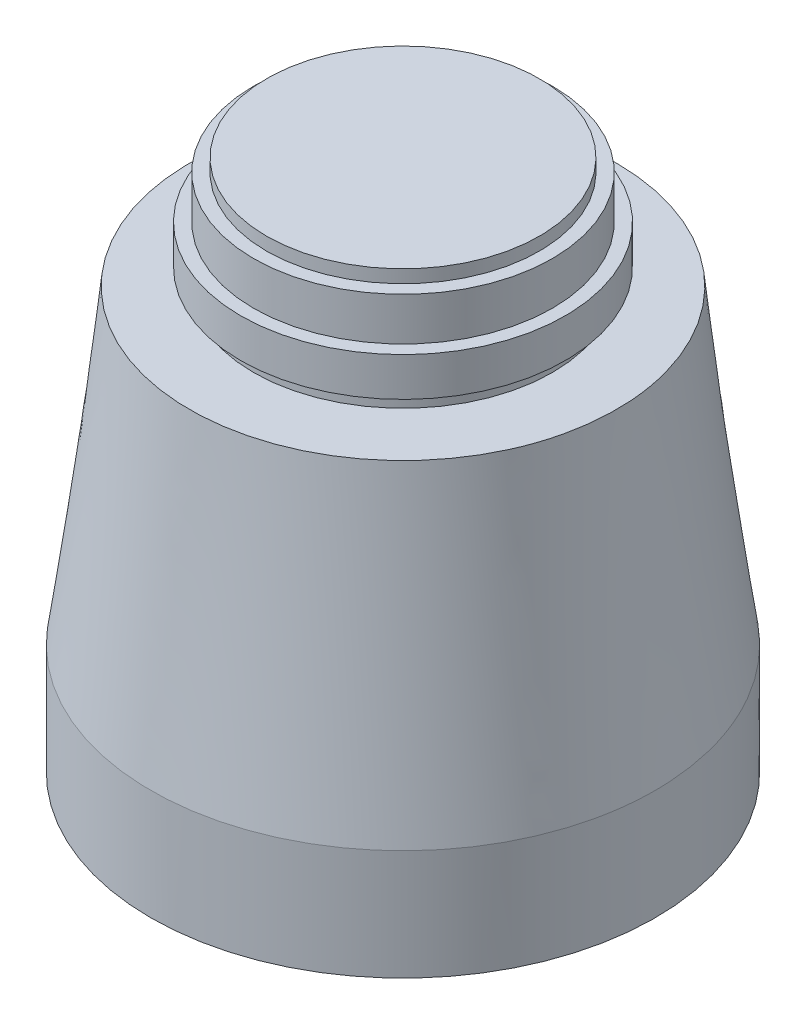
ISO-10303-21;
HEADER;
FILE_DESCRIPTION(('STEP AP214'),'2;1');
FILE_NAME('part.step','',(''),(''),'','','');
FILE_SCHEMA(('AUTOMOTIVE_DESIGN { 1 0 10303 214 1 1 1 1 }'));
ENDSEC;
DATA;
#1=APPLICATION_CONTEXT('core data for automotive mechanical design processes');
#2=APPLICATION_PROTOCOL_DEFINITION('international standard','automotive_design',2000,#1);
#3=PRODUCT_CONTEXT('',#1,'mechanical');
#4=PRODUCT('Part','Part','',(#3));
#5=PRODUCT_RELATED_PRODUCT_CATEGORY('part','',(#4));
#6=PRODUCT_DEFINITION_FORMATION('','',#4);
#7=PRODUCT_DEFINITION_CONTEXT('part definition',#1,'design');
#8=PRODUCT_DEFINITION('design','',#6,#7);
#9=PRODUCT_DEFINITION_SHAPE('','',#8);
#10=(LENGTH_UNIT() NAMED_UNIT(*) SI_UNIT(.MILLI.,.METRE.));
#11=(NAMED_UNIT(*) PLANE_ANGLE_UNIT() SI_UNIT($,.RADIAN.));
#12=(NAMED_UNIT(*) SI_UNIT($,.STERADIAN.) SOLID_ANGLE_UNIT());
#13=UNCERTAINTY_MEASURE_WITH_UNIT(LENGTH_MEASURE(1.E-05),#10,'distance_accuracy_value','');
#14=(GEOMETRIC_REPRESENTATION_CONTEXT(3) GLOBAL_UNCERTAINTY_ASSIGNED_CONTEXT((#13)) GLOBAL_UNIT_ASSIGNED_CONTEXT((#10,
#11,#12)) REPRESENTATION_CONTEXT('',''));
#15=CARTESIAN_POINT('',(0.,0.,0.));
#16=DIRECTION('',(0.,0.,1.));
#17=DIRECTION('',(1.,0.,0.));
#18=AXIS2_PLACEMENT_3D('',#15,#16,#17);
#19=CARTESIAN_POINT('',(0.,32.53,0.));
#20=DIRECTION('',(0.,1.,0.));
#21=DIRECTION('',(0.,0.,1.));
#22=AXIS2_PLACEMENT_3D('',#19,#20,#21);
#23=PLANE('',#22);
#24=CARTESIAN_POINT('',(0.,32.53,0.));
#25=DIRECTION('',(0.,1.,0.));
#26=DIRECTION('',(0.,0.,1.));
#27=AXIS2_PLACEMENT_3D('',#24,#25,#26);
#28=CIRCLE('',#27,11.55);
#29=CARTESIAN_POINT('',(0.,32.53,11.55));
#30=VERTEX_POINT('',#29);
#31=EDGE_CURVE('E46',#30,#30,#28,.T.);
#32=ORIENTED_EDGE('',*,*,#31,.F.);
#33=EDGE_LOOP('',(#32));
#34=FACE_BOUND('',#33,.T.);
#35=CARTESIAN_POINT('',(0.,32.53,0.));
#36=DIRECTION('',(0.,1.,0.));
#37=DIRECTION('',(0.,0.,1.));
#38=AXIS2_PLACEMENT_3D('',#35,#36,#37);
#39=CIRCLE('',#38,16.5);
#40=CARTESIAN_POINT('',(-16.4507498294767,32.53,-1.27390346885986));
#41=VERTEX_POINT('',#40);
#42=EDGE_CURVE('E81',#41,#41,#39,.T.);
#43=ORIENTED_EDGE('',*,*,#42,.T.);
#44=EDGE_LOOP('',(#43));
#45=FACE_BOUND('',#44,.T.);
#46=ADVANCED_FACE('F39',(#34,#45),#23,.T.);
#47=CARTESIAN_POINT('',(0.,41.16,0.));
#48=DIRECTION('',(0.,-1.,0.));
#49=DIRECTION('',(0.,0.,-1.));
#50=AXIS2_PLACEMENT_3D('',#47,#48,#49);
#51=CYLINDRICAL_SURFACE('',#50,11.55);
#52=CARTESIAN_POINT('',(0.,36.83,0.));
#53=DIRECTION('',(0.,1.,0.));
#54=DIRECTION('',(0.,0.,1.));
#55=AXIS2_PLACEMENT_3D('',#52,#53,#54);
#56=CIRCLE('',#55,11.55);
#57=CARTESIAN_POINT('',(0.,36.83,11.55));
#58=VERTEX_POINT('',#57);
#59=EDGE_CURVE('E55',#58,#58,#56,.T.);
#60=ORIENTED_EDGE('',*,*,#59,.T.);
#61=EDGE_LOOP('',(#60));
#62=FACE_BOUND('',#61,.T.);
#63=CARTESIAN_POINT('',(0.,40.16,0.));
#64=DIRECTION('',(0.,1.,0.));
#65=DIRECTION('',(0.,0.,1.));
#66=AXIS2_PLACEMENT_3D('',#63,#64,#65);
#67=CIRCLE('',#66,11.55);
#68=CARTESIAN_POINT('',(0.,40.16,11.55));
#69=VERTEX_POINT('',#68);
#70=EDGE_CURVE('E68',#69,#69,#67,.T.);
#71=ORIENTED_EDGE('',*,*,#70,.F.);
#72=EDGE_LOOP('',(#71));
#73=FACE_BOUND('',#72,.T.);
#74=ADVANCED_FACE('F105',(#62,#73),#51,.T.);
#75=ORIENTED_EDGE('',*,*,#31,.T.);
#76=EDGE_LOOP('',(#75));
#77=FACE_BOUND('',#76,.T.);
#78=CARTESIAN_POINT('',(0.,33.83,0.));
#79=DIRECTION('',(0.,1.,0.));
#80=DIRECTION('',(0.,0.,1.));
#81=AXIS2_PLACEMENT_3D('',#78,#79,#80);
#82=CIRCLE('',#81,11.55);
#83=CARTESIAN_POINT('',(0.,33.83,11.55));
#84=VERTEX_POINT('',#83);
#85=EDGE_CURVE('E11',#84,#84,#82,.T.);
#86=ORIENTED_EDGE('',*,*,#85,.F.);
#87=EDGE_LOOP('',(#86));
#88=FACE_BOUND('',#87,.T.);
#89=ADVANCED_FACE('F111',(#77,#88),#51,.T.);
#90=CARTESIAN_POINT('',(0.,33.83,0.));
#91=DIRECTION('',(0.,1.,0.));
#92=DIRECTION('',(0.,0.,1.));
#93=AXIS2_PLACEMENT_3D('',#90,#91,#92);
#94=CYLINDRICAL_SURFACE('',#93,12.55);
#95=CARTESIAN_POINT('',(0.,33.83,0.));
#96=DIRECTION('',(0.,1.,0.));
#97=DIRECTION('',(0.,0.,1.));
#98=AXIS2_PLACEMENT_3D('',#95,#96,#97);
#99=CIRCLE('',#98,12.55);
#100=CARTESIAN_POINT('',(0.,33.83,12.55));
#101=VERTEX_POINT('',#100);
#102=EDGE_CURVE('E61',#101,#101,#99,.T.);
#103=ORIENTED_EDGE('',*,*,#102,.T.);
#104=EDGE_LOOP('',(#103));
#105=FACE_BOUND('',#104,.T.);
#106=CARTESIAN_POINT('',(0.,36.83,0.));
#107=DIRECTION('',(0.,1.,0.));
#108=DIRECTION('',(0.,0.,1.));
#109=AXIS2_PLACEMENT_3D('',#106,#107,#108);
#110=CIRCLE('',#109,12.55);
#111=CARTESIAN_POINT('',(0.,36.83,12.55));
#112=VERTEX_POINT('',#111);
#113=EDGE_CURVE('E58',#112,#112,#110,.T.);
#114=ORIENTED_EDGE('',*,*,#113,.F.);
#115=EDGE_LOOP('',(#114));
#116=FACE_BOUND('',#115,.T.);
#117=ADVANCED_FACE('F114',(#105,#116),#94,.T.);
#118=CARTESIAN_POINT('',(0.,33.83,0.));
#119=DIRECTION('',(0.,1.,0.));
#120=DIRECTION('',(0.,0.,1.));
#121=AXIS2_PLACEMENT_3D('',#118,#119,#120);
#122=PLANE('',#121);
#123=ORIENTED_EDGE('',*,*,#85,.T.);
#124=EDGE_LOOP('',(#123));
#125=FACE_BOUND('',#124,.T.);
#126=ORIENTED_EDGE('',*,*,#102,.F.);
#127=EDGE_LOOP('',(#126));
#128=FACE_BOUND('',#127,.T.);
#129=ADVANCED_FACE('F117',(#125,#128),#122,.F.);
#130=CARTESIAN_POINT('',(0.,36.83,0.));
#131=DIRECTION('',(0.,1.,0.));
#132=DIRECTION('',(0.,0.,1.));
#133=AXIS2_PLACEMENT_3D('',#130,#131,#132);
#134=PLANE('',#133);
#135=ORIENTED_EDGE('',*,*,#59,.F.);
#136=EDGE_LOOP('',(#135));
#137=FACE_BOUND('',#136,.T.);
#138=ORIENTED_EDGE('',*,*,#113,.T.);
#139=EDGE_LOOP('',(#138));
#140=FACE_BOUND('',#139,.T.);
#141=ADVANCED_FACE('F118',(#137,#140),#134,.T.);
#142=CARTESIAN_POINT('',(0.,40.16,0.));
#143=DIRECTION('',(0.,1.,0.));
#144=DIRECTION('',(0.,0.,1.));
#145=AXIS2_PLACEMENT_3D('',#142,#143,#144);
#146=PLANE('',#145);
#147=CARTESIAN_POINT('',(0.,40.16,0.));
#148=DIRECTION('',(0.,1.,0.));
#149=DIRECTION('',(0.,0.,1.));
#150=AXIS2_PLACEMENT_3D('',#147,#148,#149);
#151=CIRCLE('',#150,10.55);
#152=CARTESIAN_POINT('',(0.,40.16,10.55));
#153=VERTEX_POINT('',#152);
#154=EDGE_CURVE('E72',#153,#153,#151,.T.);
#155=ORIENTED_EDGE('',*,*,#154,.F.);
#156=EDGE_LOOP('',(#155));
#157=FACE_BOUND('',#156,.T.);
#158=ORIENTED_EDGE('',*,*,#70,.T.);
#159=EDGE_LOOP('',(#158));
#160=FACE_BOUND('',#159,.T.);
#161=ADVANCED_FACE('F121',(#157,#160),#146,.T.);
#162=CARTESIAN_POINT('',(0.,40.16,0.));
#163=DIRECTION('',(0.,1.,0.));
#164=DIRECTION('',(0.,0.,1.));
#165=AXIS2_PLACEMENT_3D('',#162,#163,#164);
#166=CYLINDRICAL_SURFACE('',#165,10.55);
#167=ORIENTED_EDGE('',*,*,#154,.T.);
#168=EDGE_LOOP('',(#167));
#169=FACE_BOUND('',#168,.T.);
#170=CARTESIAN_POINT('',(0.,41.16,0.));
#171=DIRECTION('',(0.,1.,0.));
#172=DIRECTION('',(0.,0.,1.));
#173=AXIS2_PLACEMENT_3D('',#170,#171,#172);
#174=CIRCLE('',#173,10.55);
#175=CARTESIAN_POINT('',(0.,41.16,10.55));
#176=VERTEX_POINT('',#175);
#177=EDGE_CURVE('E73',#176,#176,#174,.T.);
#178=ORIENTED_EDGE('',*,*,#177,.F.);
#179=EDGE_LOOP('',(#178));
#180=FACE_BOUND('',#179,.T.);
#181=ADVANCED_FACE('F98',(#169,#180),#166,.T.);
#182=CARTESIAN_POINT('',(0.,41.16,0.));
#183=DIRECTION('',(0.,1.,0.));
#184=DIRECTION('',(0.,0.,1.));
#185=AXIS2_PLACEMENT_3D('',#182,#183,#184);
#186=PLANE('',#185);
#187=ORIENTED_EDGE('',*,*,#177,.T.);
#188=EDGE_LOOP('',(#187));
#189=FACE_BOUND('',#188,.T.);
#190=ADVANCED_FACE('F89',(#189),#186,.T.);
#191=CARTESIAN_POINT('',(-19.2750126101658,8.53,2.95362300877238));
#192=CARTESIAN_POINT('',(-16.4507498294767,32.53,-1.27390346885986));
#193=CARTESIAN_POINT('',(-13.367766592621,8.53,41.503648229104));
#194=CARTESIAN_POINT('',(-18.9985567671964,32.53,31.6275961900935));
#195=CARTESIAN_POINT('',(25.1822586277106,8.53,35.5964022115592));
#196=CARTESIAN_POINT('',(13.902942891757,32.53,34.1754031278132));
#197=CARTESIAN_POINT('',(19.2750126101658,8.53,-2.95362300877239));
#198=CARTESIAN_POINT('',(16.4507498294767,32.53,1.27390346885986));
#199=CARTESIAN_POINT('',(13.367766592621,8.53,-41.503648229104));
#200=CARTESIAN_POINT('',(18.9985567671964,32.53,-31.6275961900935));
#201=CARTESIAN_POINT('',(-25.1822586277106,8.53,-35.5964022115592));
#202=CARTESIAN_POINT('',(-13.902942891757,32.53,-34.1754031278132));
#203=CARTESIAN_POINT('',(-19.2750126101658,8.53,2.95362300877238));
#204=CARTESIAN_POINT('',(-16.4507498294767,32.53,-1.27390346885986));
#205=(BOUNDED_SURFACE() B_SPLINE_SURFACE(3,1,((#191,#192),(#193,#194),(#195,#196),(#197,#198),
(#199,#200),(#201,#202),(#203,#204)),.UNSPECIFIED.,.T.,.F.,.F.) B_SPLINE_SURFACE_WITH_KNOTS((4,
3,4),(2,2),(0.,0.5,1.),(0.,1.),
.UNSPECIFIED.) GEOMETRIC_REPRESENTATION_ITEM() RATIONAL_B_SPLINE_SURFACE(((1.,1.),
(0.333333333333333,0.333333333333333),(0.333333333333333,0.333333333333333),(1.,1.),
(0.333333333333333,0.333333333333333),(0.333333333333333,0.333333333333333),(1.,1.))) REPRESENTATION_ITEM('') SURFACE());
#206=CARTESIAN_POINT('',(0.,8.53,0.));
#207=DIRECTION('',(0.,1.,0.));
#208=DIRECTION('',(0.,0.,1.));
#209=AXIS2_PLACEMENT_3D('',#206,#207,#208);
#210=CIRCLE('',#209,19.5);
#211=CARTESIAN_POINT('',(-19.2750126101658,8.53,2.95362300877238));
#212=VERTEX_POINT('',#211);
#213=EDGE_CURVE('E76',#212,#212,#210,.T.);
#214=CARTESIAN_POINT('',(-19.2750126101658,8.53,2.95362300877238));
#215=CARTESIAN_POINT('',(-19.2455932062003,8.78,2.90958627463038));
#216=CARTESIAN_POINT('',(-19.2161738022348,9.03,2.86554954048838));
#217=CARTESIAN_POINT('',(-19.1573349943037,9.53,2.77747607220437));
#218=CARTESIAN_POINT('',(-19.1279155903382,9.78,2.73343933806237));
#219=CARTESIAN_POINT('',(-19.0690767824072,10.28,2.64536586977837));
#220=CARTESIAN_POINT('',(-19.0396573784417,10.53,2.60132913563636));
#221=CARTESIAN_POINT('',(-18.9808185705107,11.03,2.51325566735236));
#222=CARTESIAN_POINT('',(-18.9513991665452,11.28,2.46921893321036));
#223=CARTESIAN_POINT('',(-18.8925603586141,11.78,2.38114546492635));
#224=CARTESIAN_POINT('',(-18.8631409546486,12.03,2.33710873078435));
#225=CARTESIAN_POINT('',(-18.8043021467176,12.53,2.24903526250034));
#226=CARTESIAN_POINT('',(-18.7748827427521,12.78,2.20499852835834));
#227=CARTESIAN_POINT('',(-18.7160439348211,13.28,2.11692506007434));
#228=CARTESIAN_POINT('',(-18.6866245308556,13.53,2.07288832593233));
#229=CARTESIAN_POINT('',(-18.6277857229245,14.03,1.98481485764833));
#230=CARTESIAN_POINT('',(-18.598366318959,14.28,1.94077812350633));
#231=CARTESIAN_POINT('',(-18.539527511028,14.78,1.85270465522232));
#232=CARTESIAN_POINT('',(-18.5101081070625,15.03,1.80866792108032));
#233=CARTESIAN_POINT('',(-18.4512692991315,15.53,1.72059445279631));
#234=CARTESIAN_POINT('',(-18.421849895166,15.78,1.67655771865431));
#235=CARTESIAN_POINT('',(-18.3630110872349,16.28,1.5884842503703));
#236=CARTESIAN_POINT('',(-18.3335916832694,16.53,1.5444475162283));
#237=CARTESIAN_POINT('',(-18.2747528753384,17.03,1.4563740479443));
#238=CARTESIAN_POINT('',(-18.2453334713729,17.28,1.41233731380229));
#239=CARTESIAN_POINT('',(-18.1864946634419,17.78,1.32426384551829));
#240=CARTESIAN_POINT('',(-18.1570752594763,18.03,1.28022711137629));
#241=CARTESIAN_POINT('',(-18.0982364515453,18.53,1.19215364309228));
#242=CARTESIAN_POINT('',(-18.0688170475798,18.78,1.14811690895028));
#243=CARTESIAN_POINT('',(-18.0099782396488,19.28,1.06004344066627));
#244=CARTESIAN_POINT('',(-17.9805588356833,19.53,1.01600670652427));
#245=CARTESIAN_POINT('',(-17.9217200277523,20.03,0.927933238240266));
#246=CARTESIAN_POINT('',(-17.8923006237867,20.28,0.883896504098264));
#247=CARTESIAN_POINT('',(-17.8334618158557,20.78,0.795823035814259));
#248=CARTESIAN_POINT('',(-17.8040424118902,21.03,0.751786301672256));
#249=CARTESIAN_POINT('',(-17.7452036039592,21.53,0.663712833388251));
#250=CARTESIAN_POINT('',(-17.7157841999937,21.78,0.619676099246248));
#251=CARTESIAN_POINT('',(-17.6569453920627,22.28,0.531602630962243));
#252=CARTESIAN_POINT('',(-17.6275259880971,22.53,0.487565896820241));
#253=CARTESIAN_POINT('',(-17.5686871801661,23.03,0.399492428536235));
#254=CARTESIAN_POINT('',(-17.5392677762006,23.28,0.355455694394233));
#255=CARTESIAN_POINT('',(-17.4804289682696,23.78,0.267382226110227));
#256=CARTESIAN_POINT('',(-17.4510095643041,24.03,0.223345491968225));
#257=CARTESIAN_POINT('',(-17.392170756373,24.53,0.13527202368422));
#258=CARTESIAN_POINT('',(-17.3627513524075,24.78,0.0912352895422174));
#259=CARTESIAN_POINT('',(-17.3039125444765,25.28,0.00316182125821215));
#260=CARTESIAN_POINT('',(-17.274493140511,25.53,-0.0408749128837905));
#261=CARTESIAN_POINT('',(-17.21565433258,26.03,-0.128948381167796));
#262=CARTESIAN_POINT('',(-17.1862349286145,26.28,-0.172985115309798));
#263=CARTESIAN_POINT('',(-17.1273961206834,26.78,-0.261058583593803));
#264=CARTESIAN_POINT('',(-17.0979767167179,27.03,-0.305095317735806));
#265=CARTESIAN_POINT('',(-17.0391379087869,27.53,-0.393168786019811));
#266=CARTESIAN_POINT('',(-17.0097185048214,27.78,-0.437205520161813));
#267=CARTESIAN_POINT('',(-16.9508796968904,28.28,-0.525278988445819));
#268=CARTESIAN_POINT('',(-16.9214602929249,28.53,-0.569315722587821));
#269=CARTESIAN_POINT('',(-16.8626214849938,29.03,-0.657389190871826));
#270=CARTESIAN_POINT('',(-16.8332020810283,29.28,-0.701425925013829));
#271=CARTESIAN_POINT('',(-16.7743632730973,29.78,-0.789499393297834));
#272=CARTESIAN_POINT('',(-16.7449438691318,30.03,-0.833536127439837));
#273=CARTESIAN_POINT('',(-16.6861050612008,30.53,-0.921609595723842));
#274=CARTESIAN_POINT('',(-16.6566856572353,30.78,-0.965646329865844));
#275=CARTESIAN_POINT('',(-16.5978468493042,31.28,-1.05371979814985));
#276=CARTESIAN_POINT('',(-16.5684274453387,31.53,-1.09775653229185));
#277=CARTESIAN_POINT('',(-16.5095886374077,32.03,-1.18583000057586));
#278=CARTESIAN_POINT('',(-16.4801692334422,32.28,-1.22986673471786));
#279=CARTESIAN_POINT('',(-16.4507498294767,32.53,-1.27390346885986));
#280=B_SPLINE_CURVE_WITH_KNOTS('',3,(#214,#215,#216,#217,#218,#219,#220,#221,#222,#223,#224,
#225,#226,#227,#228,#229,#230,#231,#232,#233,#234,#235,#236,#237,#238,#239,#240,#241,#242,#243,
#244,#245,#246,#247,#248,#249,#250,#251,#252,#253,#254,#255,#256,#257,#258,#259,#260,#261,#262,
#263,#264,#265,#266,#267,#268,#269,#270,#271,#272,#273,#274,#275,#276,#277,#278,#279),
.UNSPECIFIED.,.F.,.F.,(4,2,2,2,2,2,2,2,2,2,2,2,2,2,2,2,2,2,2,2,2,2,2,2,2,2,2,2,2,2,2,2,4),(0.,
0.766643735741847,1.53328747148369,2.29993120722554,3.06657494296739,3.83321867870923,
4.59986241445108,5.36650615019293,6.13314988593477,6.89979362167662,7.66643735741847,
8.43308109316031,9.19972482890216,9.96636856464401,10.7330123003859,11.4996560361277,
12.2662997718695,13.0329435076114,13.7995872433532,14.5662309790951,15.3328747148369,
16.0995184505788,16.8661621863206,17.6328059220625,18.3994496578043,19.1660933935462,
19.932737129288,20.6993808650299,21.4660246007717,22.2326683365135,22.9993120722554,
23.7659558079972,24.5325995437391),.UNSPECIFIED.);
#281=EDGE_CURVE('BSEAM86',#212,#41,#280,.T.);
#282=ORIENTED_EDGE('',*,*,#213,.T.);
#283=ORIENTED_EDGE('',*,*,#42,.F.);
#284=ORIENTED_EDGE('',*,*,#281,.T.);
#285=ORIENTED_EDGE('',*,*,#281,.F.);
#286=EDGE_LOOP('',(#282,#284,#283,#285));
#287=FACE_BOUND('',#286,.T.);
#288=ADVANCED_FACE('F86',(#287),#205,.T.);
#289=CARTESIAN_POINT('',(0.,0.,0.));
#290=DIRECTION('',(0.,1.,0.));
#291=DIRECTION('',(0.,0.,1.));
#292=AXIS2_PLACEMENT_3D('',#289,#290,#291);
#293=PLANE('',#292);
#294=CARTESIAN_POINT('',(0.,0.,0.));
#295=DIRECTION('',(0.,1.,0.));
#296=DIRECTION('',(0.,0.,1.));
#297=AXIS2_PLACEMENT_3D('',#294,#295,#296);
#298=CIRCLE('',#297,19.5);
#299=CARTESIAN_POINT('',(0.,0.,19.5));
#300=VERTEX_POINT('',#299);
#301=EDGE_CURVE('E50',#300,#300,#298,.T.);
#302=ORIENTED_EDGE('',*,*,#301,.F.);
#303=EDGE_LOOP('',(#302));
#304=FACE_BOUND('',#303,.T.);
#305=ADVANCED_FACE('F88',(#304),#293,.F.);
#306=CARTESIAN_POINT('',(0.,32.53,0.));
#307=DIRECTION('',(0.,-1.,0.));
#308=DIRECTION('',(0.,0.,-1.));
#309=AXIS2_PLACEMENT_3D('',#306,#307,#308);
#310=CYLINDRICAL_SURFACE('',#309,19.5);
#311=ORIENTED_EDGE('',*,*,#301,.T.);
#312=EDGE_LOOP('',(#311));
#313=FACE_BOUND('',#312,.T.);
#314=ORIENTED_EDGE('',*,*,#213,.F.);
#315=EDGE_LOOP('',(#314));
#316=FACE_BOUND('',#315,.T.);
#317=ADVANCED_FACE('F41',(#313,#316),#310,.T.);
#318=CLOSED_SHELL('',(#46,#74,#89,#117,#129,#141,#161,#181,#190,#288,#305,#317));
#319=MANIFOLD_SOLID_BREP('B2',#318);
#320=ADVANCED_BREP_SHAPE_REPRESENTATION('',(#18,#319),#14);
#321=SHAPE_DEFINITION_REPRESENTATION(#9,#320);
ENDSEC;
END-ISO-10303-21;
